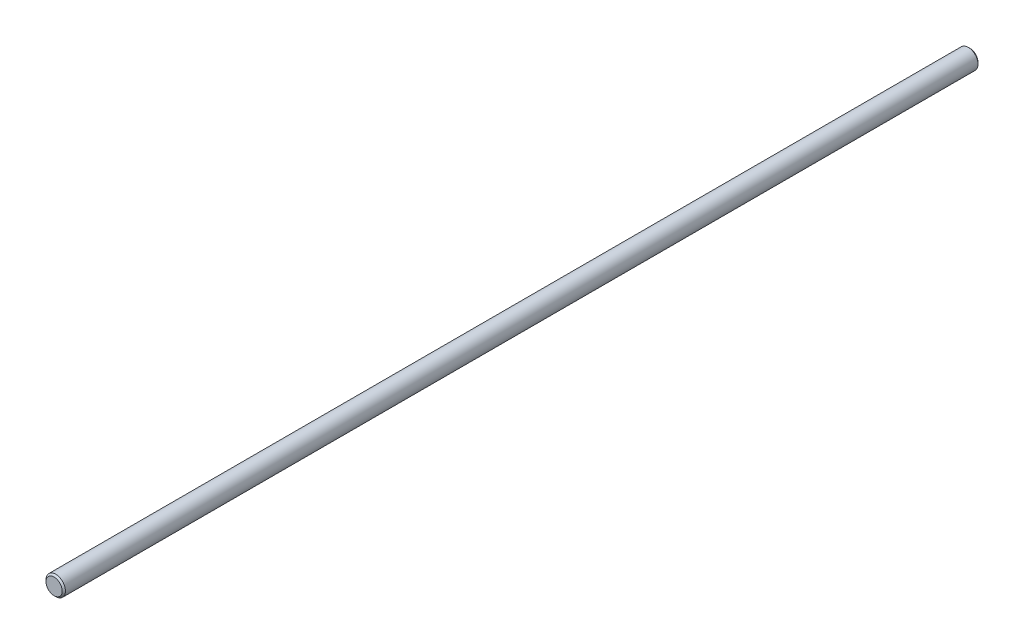
ISO-10303-21;
HEADER;
FILE_DESCRIPTION(('STEP AP214'),'2;1');
FILE_NAME('part.step','',(''),(''),'','','');
FILE_SCHEMA(('AUTOMOTIVE_DESIGN { 1 0 10303 214 1 1 1 1 }'));
ENDSEC;
DATA;
#1=APPLICATION_CONTEXT('core data for automotive mechanical design processes');
#2=APPLICATION_PROTOCOL_DEFINITION('international standard','automotive_design',2000,#1);
#3=PRODUCT_CONTEXT('',#1,'mechanical');
#4=PRODUCT('Part','Part','',(#3));
#5=PRODUCT_RELATED_PRODUCT_CATEGORY('part','',(#4));
#6=PRODUCT_DEFINITION_FORMATION('','',#4);
#7=PRODUCT_DEFINITION_CONTEXT('part definition',#1,'design');
#8=PRODUCT_DEFINITION('design','',#6,#7);
#9=PRODUCT_DEFINITION_SHAPE('','',#8);
#10=(LENGTH_UNIT() NAMED_UNIT(*) SI_UNIT(.MILLI.,.METRE.));
#11=(NAMED_UNIT(*) PLANE_ANGLE_UNIT() SI_UNIT($,.RADIAN.));
#12=(NAMED_UNIT(*) SI_UNIT($,.STERADIAN.) SOLID_ANGLE_UNIT());
#13=UNCERTAINTY_MEASURE_WITH_UNIT(LENGTH_MEASURE(1.E-05),#10,'distance_accuracy_value','');
#14=(GEOMETRIC_REPRESENTATION_CONTEXT(3) GLOBAL_UNCERTAINTY_ASSIGNED_CONTEXT((#13)) GLOBAL_UNIT_ASSIGNED_CONTEXT((#10,
#11,#12)) REPRESENTATION_CONTEXT('',''));
#15=CARTESIAN_POINT('',(0.,0.,0.));
#16=DIRECTION('',(0.,0.,1.));
#17=DIRECTION('',(1.,0.,0.));
#18=AXIS2_PLACEMENT_3D('',#15,#16,#17);
#19=CARTESIAN_POINT('',(0.,0.,141.25));
#20=DIRECTION('',(0.,0.,-1.));
#21=DIRECTION('',(-1.,0.,0.));
#22=AXIS2_PLACEMENT_3D('',#19,#20,#21);
#23=CYLINDRICAL_SURFACE('',#22,3.);
#24=CARTESIAN_POINT('',(0.,0.,-140.75));
#25=DIRECTION('',(0.,0.,1.));
#26=DIRECTION('',(1.,0.,0.));
#27=AXIS2_PLACEMENT_3D('',#24,#25,#26);
#28=CIRCLE('',#27,3.);
#29=CARTESIAN_POINT('',(3.,0.,-140.75));
#30=VERTEX_POINT('',#29);
#31=EDGE_CURVE('E44',#30,#30,#28,.T.);
#32=ORIENTED_EDGE('',*,*,#31,.T.);
#33=EDGE_LOOP('',(#32));
#34=FACE_BOUND('',#33,.T.);
#35=CARTESIAN_POINT('',(0.,0.,140.75));
#36=DIRECTION('',(0.,0.,1.));
#37=DIRECTION('',(1.,0.,0.));
#38=AXIS2_PLACEMENT_3D('',#35,#36,#37);
#39=CIRCLE('',#38,3.);
#40=CARTESIAN_POINT('',(3.,0.,140.75));
#41=VERTEX_POINT('',#40);
#42=EDGE_CURVE('E48',#41,#41,#39,.F.);
#43=ORIENTED_EDGE('',*,*,#42,.T.);
#44=EDGE_LOOP('',(#43));
#45=FACE_BOUND('',#44,.T.);
#46=ADVANCED_FACE('F32',(#34,#45),#23,.T.);
#47=CARTESIAN_POINT('',(0.,0.,141.25));
#48=DIRECTION('',(0.,0.,1.));
#49=DIRECTION('',(1.,0.,0.));
#50=AXIS2_PLACEMENT_3D('',#47,#48,#49);
#51=PLANE('',#50);
#52=CARTESIAN_POINT('',(0.,0.,141.25));
#53=DIRECTION('',(0.,0.,1.));
#54=DIRECTION('',(1.,0.,0.));
#55=AXIS2_PLACEMENT_3D('',#52,#53,#54);
#56=CIRCLE('',#55,2.5);
#57=CARTESIAN_POINT('',(2.5,0.,141.25));
#58=VERTEX_POINT('',#57);
#59=EDGE_CURVE('E10',#58,#58,#56,.T.);
#60=ORIENTED_EDGE('',*,*,#59,.T.);
#61=EDGE_LOOP('',(#60));
#62=FACE_BOUND('',#61,.T.);
#63=ADVANCED_FACE('F64',(#62),#51,.T.);
#64=CARTESIAN_POINT('',(0.,0.,-141.25));
#65=DIRECTION('',(0.,0.,1.));
#66=DIRECTION('',(1.,0.,0.));
#67=AXIS2_PLACEMENT_3D('',#64,#65,#66);
#68=PLANE('',#67);
#69=CARTESIAN_POINT('',(0.,0.,-141.25));
#70=DIRECTION('',(0.,0.,1.));
#71=DIRECTION('',(1.,0.,0.));
#72=AXIS2_PLACEMENT_3D('',#69,#70,#71);
#73=CIRCLE('',#72,2.49999999999997);
#74=CARTESIAN_POINT('',(2.49999999999997,0.,-141.25));
#75=VERTEX_POINT('',#74);
#76=EDGE_CURVE('E40',#75,#75,#73,.F.);
#77=ORIENTED_EDGE('',*,*,#76,.T.);
#78=EDGE_LOOP('',(#77));
#79=FACE_BOUND('',#78,.T.);
#80=ADVANCED_FACE('F61',(#79),#68,.F.);
#81=CARTESIAN_POINT('',(0.,0.,-140.75));
#82=DIRECTION('',(0.,0.,1.));
#83=DIRECTION('',(1.,0.,0.));
#84=AXIS2_PLACEMENT_3D('',#81,#82,#83);
#85=CONICAL_SURFACE('',#84,3.,0.785398163397418);
#86=ORIENTED_EDGE('',*,*,#76,.F.);
#87=EDGE_LOOP('',(#86));
#88=FACE_BOUND('',#87,.T.);
#89=ORIENTED_EDGE('',*,*,#31,.F.);
#90=EDGE_LOOP('',(#89));
#91=FACE_BOUND('',#90,.T.);
#92=ADVANCED_FACE('F57',(#88,#91),#85,.T.);
#93=CARTESIAN_POINT('',(0.,0.,141.25));
#94=DIRECTION('',(0.,0.,-1.));
#95=DIRECTION('',(-1.,0.,0.));
#96=AXIS2_PLACEMENT_3D('',#93,#94,#95);
#97=CONICAL_SURFACE('',#96,2.5,0.785398163397446);
#98=ORIENTED_EDGE('',*,*,#42,.F.);
#99=EDGE_LOOP('',(#98));
#100=FACE_BOUND('',#99,.T.);
#101=ORIENTED_EDGE('',*,*,#59,.F.);
#102=EDGE_LOOP('',(#101));
#103=FACE_BOUND('',#102,.T.);
#104=ADVANCED_FACE('F35',(#100,#103),#97,.T.);
#105=CLOSED_SHELL('',(#46,#63,#80,#92,#104));
#106=MANIFOLD_SOLID_BREP('B2',#105);
#107=ADVANCED_BREP_SHAPE_REPRESENTATION('',(#18,#106),#14);
#108=SHAPE_DEFINITION_REPRESENTATION(#9,#107);
ENDSEC;
END-ISO-10303-21;
